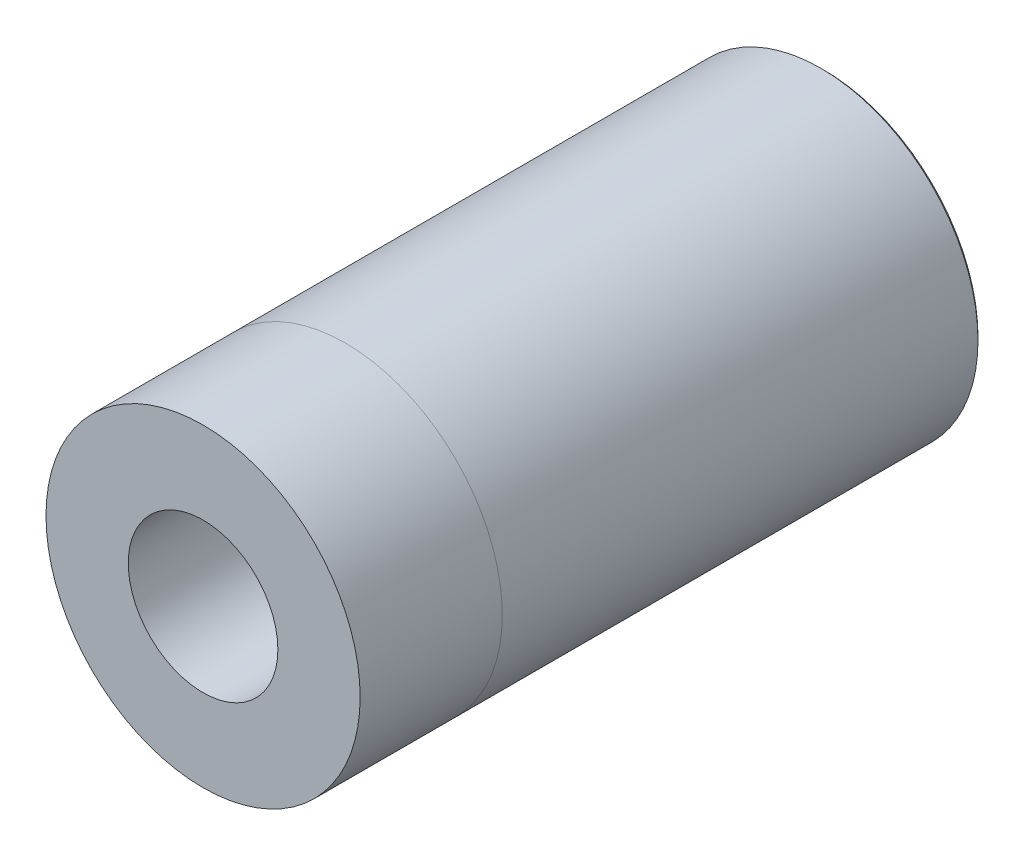
ISO-10303-21;
HEADER;
FILE_DESCRIPTION(('STEP AP214'),'2;1');
FILE_NAME('part.step','',(''),(''),'','','');
FILE_SCHEMA(('AUTOMOTIVE_DESIGN { 1 0 10303 214 1 1 1 1 }'));
ENDSEC;
DATA;
#1=APPLICATION_CONTEXT('core data for automotive mechanical design processes');
#2=APPLICATION_PROTOCOL_DEFINITION('international standard','automotive_design',2000,#1);
#3=PRODUCT_CONTEXT('',#1,'mechanical');
#4=PRODUCT('Part','Part','',(#3));
#5=PRODUCT_RELATED_PRODUCT_CATEGORY('part','',(#4));
#6=PRODUCT_DEFINITION_FORMATION('','',#4);
#7=PRODUCT_DEFINITION_CONTEXT('part definition',#1,'design');
#8=PRODUCT_DEFINITION('design','',#6,#7);
#9=PRODUCT_DEFINITION_SHAPE('','',#8);
#10=(LENGTH_UNIT() NAMED_UNIT(*) SI_UNIT(.MILLI.,.METRE.));
#11=(NAMED_UNIT(*) PLANE_ANGLE_UNIT() SI_UNIT($,.RADIAN.));
#12=(NAMED_UNIT(*) SI_UNIT($,.STERADIAN.) SOLID_ANGLE_UNIT());
#13=UNCERTAINTY_MEASURE_WITH_UNIT(LENGTH_MEASURE(1.E-05),#10,'distance_accuracy_value','');
#14=(GEOMETRIC_REPRESENTATION_CONTEXT(3) GLOBAL_UNCERTAINTY_ASSIGNED_CONTEXT((#13)) GLOBAL_UNIT_ASSIGNED_CONTEXT((#10,
#11,#12)) REPRESENTATION_CONTEXT('',''));
#15=CARTESIAN_POINT('',(0.,0.,0.));
#16=DIRECTION('',(0.,0.,1.));
#17=DIRECTION('',(1.,0.,0.));
#18=AXIS2_PLACEMENT_3D('',#15,#16,#17);
#19=CARTESIAN_POINT('',(0.,0.,41.5));
#20=DIRECTION('',(0.,0.,-1.));
#21=DIRECTION('',(-1.,0.,0.));
#22=AXIS2_PLACEMENT_3D('',#19,#20,#21);
#23=CYLINDRICAL_SURFACE('',#22,10.5);
#24=CARTESIAN_POINT('',(0.,0.,41.5));
#25=DIRECTION('',(0.,0.,1.));
#26=DIRECTION('',(1.,0.,0.));
#27=AXIS2_PLACEMENT_3D('',#24,#25,#26);
#28=CIRCLE('',#27,10.5);
#29=CARTESIAN_POINT('',(10.5,0.,41.5));
#30=VERTEX_POINT('',#29);
#31=EDGE_CURVE('E11',#30,#30,#28,.T.);
#32=ORIENTED_EDGE('',*,*,#31,.F.);
#33=EDGE_LOOP('',(#32));
#34=FACE_BOUND('',#33,.T.);
#35=CARTESIAN_POINT('',(0.,0.,32.));
#36=DIRECTION('',(0.,0.,1.));
#37=DIRECTION('',(1.,0.,0.));
#38=AXIS2_PLACEMENT_3D('',#35,#36,#37);
#39=CIRCLE('',#38,10.5);
#40=CARTESIAN_POINT('',(10.5,0.,32.));
#41=VERTEX_POINT('',#40);
#42=EDGE_CURVE('E47',#41,#41,#39,.T.);
#43=ORIENTED_EDGE('',*,*,#42,.T.);
#44=EDGE_LOOP('',(#43));
#45=FACE_BOUND('',#44,.T.);
#46=ADVANCED_FACE('F40',(#34,#45),#23,.T.);
#47=CARTESIAN_POINT('',(0.,0.,41.5));
#48=DIRECTION('',(0.,0.,1.));
#49=DIRECTION('',(1.,0.,0.));
#50=AXIS2_PLACEMENT_3D('',#47,#48,#49);
#51=PLANE('',#50);
#52=CARTESIAN_POINT('',(0.,0.,41.5));
#53=DIRECTION('',(0.,0.,1.));
#54=DIRECTION('',(1.,0.,0.));
#55=AXIS2_PLACEMENT_3D('',#52,#53,#54);
#56=CIRCLE('',#55,5.);
#57=CARTESIAN_POINT('',(5.,0.,41.5));
#58=VERTEX_POINT('',#57);
#59=EDGE_CURVE('E53',#58,#58,#56,.T.);
#60=ORIENTED_EDGE('',*,*,#59,.F.);
#61=EDGE_LOOP('',(#60));
#62=FACE_BOUND('',#61,.T.);
#63=ORIENTED_EDGE('',*,*,#31,.T.);
#64=EDGE_LOOP('',(#63));
#65=FACE_BOUND('',#64,.T.);
#66=ADVANCED_FACE('F69',(#62,#65),#51,.T.);
#67=CARTESIAN_POINT('',(0.,0.,32.));
#68=DIRECTION('',(0.,0.,1.));
#69=DIRECTION('',(1.,0.,0.));
#70=AXIS2_PLACEMENT_3D('',#67,#68,#69);
#71=PLANE('',#70);
#72=CARTESIAN_POINT('',(0.,0.,32.));
#73=DIRECTION('',(0.,0.,1.));
#74=DIRECTION('',(1.,0.,0.));
#75=AXIS2_PLACEMENT_3D('',#72,#73,#74);
#76=CIRCLE('',#75,5.);
#77=CARTESIAN_POINT('',(5.,0.,32.));
#78=VERTEX_POINT('',#77);
#79=EDGE_CURVE('E43',#78,#78,#76,.T.);
#80=ORIENTED_EDGE('',*,*,#79,.T.);
#81=EDGE_LOOP('',(#80));
#82=FACE_BOUND('',#81,.T.);
#83=ORIENTED_EDGE('',*,*,#42,.F.);
#84=EDGE_LOOP('',(#83));
#85=FACE_BOUND('',#84,.T.);
#86=ADVANCED_FACE('F60',(#82,#85),#71,.F.);
#87=CARTESIAN_POINT('',(0.,0.,0.));
#88=DIRECTION('',(0.,0.,1.));
#89=DIRECTION('',(1.,0.,0.));
#90=AXIS2_PLACEMENT_3D('',#87,#88,#89);
#91=CYLINDRICAL_SURFACE('',#90,5.);
#92=ORIENTED_EDGE('',*,*,#59,.T.);
#93=EDGE_LOOP('',(#92));
#94=FACE_BOUND('',#93,.T.);
#95=ORIENTED_EDGE('',*,*,#79,.F.);
#96=EDGE_LOOP('',(#95));
#97=FACE_BOUND('',#96,.T.);
#98=ADVANCED_FACE('F63',(#94,#97),#91,.F.);
#99=CLOSED_SHELL('',(#46,#66,#86,#98));
#100=MANIFOLD_SOLID_BREP('B2',#99);
#101=CARTESIAN_POINT('',(0.,0.,32.));
#102=DIRECTION('',(0.,0.,-1.));
#103=DIRECTION('',(-1.,0.,0.));
#104=AXIS2_PLACEMENT_3D('',#101,#102,#103);
#105=CYLINDRICAL_SURFACE('',#104,10.5);
#106=CARTESIAN_POINT('',(0.,0.,0.200000000000006));
#107=DIRECTION('',(0.,0.,1.));
#108=DIRECTION('',(1.,0.,0.));
#109=AXIS2_PLACEMENT_3D('',#106,#107,#108);
#110=CIRCLE('',#109,10.5);
#111=CARTESIAN_POINT('',(10.5,0.,0.200000000000006));
#112=VERTEX_POINT('',#111);
#113=EDGE_CURVE('E116',#112,#112,#110,.T.);
#114=ORIENTED_EDGE('',*,*,#113,.T.);
#115=EDGE_LOOP('',(#114));
#116=FACE_BOUND('',#115,.T.);
#117=CARTESIAN_POINT('',(0.,0.,32.));
#118=DIRECTION('',(0.,0.,1.));
#119=DIRECTION('',(1.,0.,0.));
#120=AXIS2_PLACEMENT_3D('',#117,#118,#119);
#121=CIRCLE('',#120,10.5);
#122=CARTESIAN_POINT('',(10.5,0.,32.));
#123=VERTEX_POINT('',#122);
#124=EDGE_CURVE('E120',#123,#123,#121,.T.);
#125=ORIENTED_EDGE('',*,*,#124,.F.);
#126=EDGE_LOOP('',(#125));
#127=FACE_BOUND('',#126,.T.);
#128=ADVANCED_FACE('F109',(#116,#127),#105,.T.);
#129=CARTESIAN_POINT('',(0.,0.,32.));
#130=DIRECTION('',(0.,0.,1.));
#131=DIRECTION('',(1.,0.,0.));
#132=AXIS2_PLACEMENT_3D('',#129,#130,#131);
#133=PLANE('',#132);
#134=CARTESIAN_POINT('',(0.,0.,32.));
#135=DIRECTION('',(0.,0.,1.));
#136=DIRECTION('',(1.,0.,0.));
#137=AXIS2_PLACEMENT_3D('',#134,#135,#136);
#138=CIRCLE('',#137,5.);
#139=CARTESIAN_POINT('',(5.,0.,32.));
#140=VERTEX_POINT('',#139);
#141=EDGE_CURVE('E124',#140,#140,#138,.T.);
#142=ORIENTED_EDGE('',*,*,#141,.F.);
#143=EDGE_LOOP('',(#142));
#144=FACE_BOUND('',#143,.T.);
#145=ORIENTED_EDGE('',*,*,#124,.T.);
#146=EDGE_LOOP('',(#145));
#147=FACE_BOUND('',#146,.T.);
#148=ADVANCED_FACE('F144',(#144,#147),#133,.T.);
#149=CARTESIAN_POINT('',(0.,0.,0.));
#150=DIRECTION('',(0.,0.,1.));
#151=DIRECTION('',(1.,0.,0.));
#152=AXIS2_PLACEMENT_3D('',#149,#150,#151);
#153=PLANE('',#152);
#154=CARTESIAN_POINT('',(0.,0.,0.));
#155=DIRECTION('',(0.,0.,1.));
#156=DIRECTION('',(1.,0.,0.));
#157=AXIS2_PLACEMENT_3D('',#154,#155,#156);
#158=CIRCLE('',#157,10.3);
#159=CARTESIAN_POINT('',(10.3,0.,0.));
#160=VERTEX_POINT('',#159);
#161=EDGE_CURVE('E39',#160,#160,#158,.F.);
#162=ORIENTED_EDGE('',*,*,#161,.T.);
#163=EDGE_LOOP('',(#162));
#164=FACE_BOUND('',#163,.T.);
#165=CARTESIAN_POINT('',(0.,0.,0.));
#166=DIRECTION('',(0.,0.,1.));
#167=DIRECTION('',(1.,0.,0.));
#168=AXIS2_PLACEMENT_3D('',#165,#166,#167);
#169=CIRCLE('',#168,5.);
#170=CARTESIAN_POINT('',(5.,0.,0.));
#171=VERTEX_POINT('',#170);
#172=EDGE_CURVE('E129',#171,#171,#169,.T.);
#173=ORIENTED_EDGE('',*,*,#172,.T.);
#174=EDGE_LOOP('',(#173));
#175=FACE_BOUND('',#174,.T.);
#176=ADVANCED_FACE('F133',(#164,#175),#153,.F.);
#177=CARTESIAN_POINT('',(0.,0.,0.));
#178=DIRECTION('',(0.,0.,1.));
#179=DIRECTION('',(1.,0.,0.));
#180=AXIS2_PLACEMENT_3D('',#177,#178,#179);
#181=CYLINDRICAL_SURFACE('',#180,5.);
#182=ORIENTED_EDGE('',*,*,#141,.T.);
#183=EDGE_LOOP('',(#182));
#184=FACE_BOUND('',#183,.T.);
#185=ORIENTED_EDGE('',*,*,#172,.F.);
#186=EDGE_LOOP('',(#185));
#187=FACE_BOUND('',#186,.T.);
#188=ADVANCED_FACE('F135',(#184,#187),#181,.F.);
#189=CARTESIAN_POINT('',(0.,0.,0.200000000000006));
#190=DIRECTION('',(0.,0.,1.));
#191=DIRECTION('',(1.,0.,0.));
#192=AXIS2_PLACEMENT_3D('',#189,#190,#191);
#193=CONICAL_SURFACE('',#192,10.5,0.785398163397435);
#194=ORIENTED_EDGE('',*,*,#161,.F.);
#195=EDGE_LOOP('',(#194));
#196=FACE_BOUND('',#195,.T.);
#197=ORIENTED_EDGE('',*,*,#113,.F.);
#198=EDGE_LOOP('',(#197));
#199=FACE_BOUND('',#198,.T.);
#200=ADVANCED_FACE('F111',(#196,#199),#193,.T.);
#201=CLOSED_SHELL('',(#128,#148,#176,#188,#200));
#202=MANIFOLD_SOLID_BREP('B6',#201);
#203=ADVANCED_BREP_SHAPE_REPRESENTATION('',(#18,#100,#202),#14);
#204=SHAPE_DEFINITION_REPRESENTATION(#9,#203);
ENDSEC;
END-ISO-10303-21;
